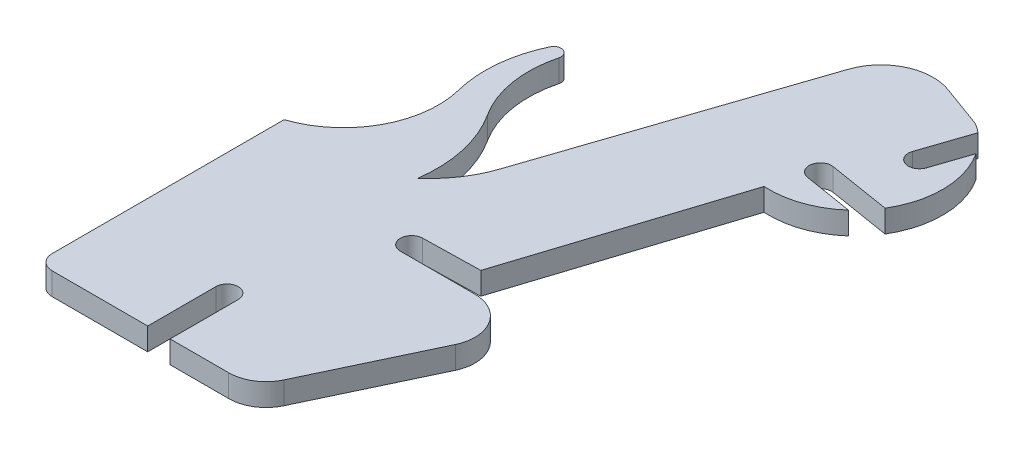
ISO-10303-21;
HEADER;
FILE_DESCRIPTION(('STEP AP214'),'2;1');
FILE_NAME('part.step','',(''),(''),'','','');
FILE_SCHEMA(('AUTOMOTIVE_DESIGN { 1 0 10303 214 1 1 1 1 }'));
ENDSEC;
DATA;
#1=APPLICATION_CONTEXT('core data for automotive mechanical design processes');
#2=APPLICATION_PROTOCOL_DEFINITION('international standard','automotive_design',2000,#1);
#3=PRODUCT_CONTEXT('',#1,'mechanical');
#4=PRODUCT('Part','Part','',(#3));
#5=PRODUCT_RELATED_PRODUCT_CATEGORY('part','',(#4));
#6=PRODUCT_DEFINITION_FORMATION('','',#4);
#7=PRODUCT_DEFINITION_CONTEXT('part definition',#1,'design');
#8=PRODUCT_DEFINITION('design','',#6,#7);
#9=PRODUCT_DEFINITION_SHAPE('','',#8);
#10=(LENGTH_UNIT() NAMED_UNIT(*) SI_UNIT(.MILLI.,.METRE.));
#11=(NAMED_UNIT(*) PLANE_ANGLE_UNIT() SI_UNIT($,.RADIAN.));
#12=(NAMED_UNIT(*) SI_UNIT($,.STERADIAN.) SOLID_ANGLE_UNIT());
#13=UNCERTAINTY_MEASURE_WITH_UNIT(LENGTH_MEASURE(1.E-05),#10,'distance_accuracy_value','');
#14=(GEOMETRIC_REPRESENTATION_CONTEXT(3) GLOBAL_UNCERTAINTY_ASSIGNED_CONTEXT((#13)) GLOBAL_UNIT_ASSIGNED_CONTEXT((#10,
#11,#12)) REPRESENTATION_CONTEXT('',''));
#15=CARTESIAN_POINT('',(0.,0.,0.));
#16=DIRECTION('',(0.,0.,1.));
#17=DIRECTION('',(1.,0.,0.));
#18=AXIS2_PLACEMENT_3D('',#15,#16,#17);
#19=CARTESIAN_POINT('',(0.,1.5,0.));
#20=DIRECTION('',(0.,0.,-1.));
#21=DIRECTION('',(-1.,0.,0.));
#22=AXIS2_PLACEMENT_3D('',#19,#20,#21);
#23=PLANE('',#22);
#24=DIRECTION('',(1.,0.,0.));
#25=VECTOR('',#24,1.);
#26=CARTESIAN_POINT('',(0.,1.5,0.));
#27=LINE('',#26,#25);
#28=CARTESIAN_POINT('',(2.,1.5,0.));
#29=VERTEX_POINT('',#28);
#30=CARTESIAN_POINT('',(14.8,1.5,0.));
#31=VERTEX_POINT('',#30);
#32=EDGE_CURVE('E241',#29,#31,#27,.T.);
#33=ORIENTED_EDGE('',*,*,#32,.F.);
#34=DIRECTION('',(0.,-1.,0.));
#35=VECTOR('',#34,1.);
#36=CARTESIAN_POINT('',(2.,1.5,0.));
#37=LINE('',#36,#35);
#38=CARTESIAN_POINT('',(2.,-1.5,0.));
#39=VERTEX_POINT('',#38);
#40=EDGE_CURVE('E292',#29,#39,#37,.T.);
#41=ORIENTED_EDGE('',*,*,#40,.T.);
#42=DIRECTION('',(1.,0.,0.));
#43=VECTOR('',#42,1.);
#44=CARTESIAN_POINT('',(0.,-1.5,0.));
#45=LINE('',#44,#43);
#46=CARTESIAN_POINT('',(14.8,-1.5,0.));
#47=VERTEX_POINT('',#46);
#48=EDGE_CURVE('E265',#39,#47,#45,.T.);
#49=ORIENTED_EDGE('',*,*,#48,.T.);
#50=DIRECTION('',(0.,-1.,0.));
#51=VECTOR('',#50,1.);
#52=CARTESIAN_POINT('',(14.8,1.5,0.));
#53=LINE('',#52,#51);
#54=EDGE_CURVE('E258',#31,#47,#53,.T.);
#55=ORIENTED_EDGE('',*,*,#54,.F.);
#56=EDGE_LOOP('',(#33,#41,#49,#55));
#57=FACE_BOUND('',#56,.T.);
#58=ADVANCED_FACE('F33',(#57),#23,.F.);
#59=CARTESIAN_POINT('',(14.8,1.5,0.));
#60=DIRECTION('',(-1.,0.,0.));
#61=DIRECTION('',(0.,0.,1.));
#62=AXIS2_PLACEMENT_3D('',#59,#60,#61);
#63=PLANE('',#62);
#64=DIRECTION('',(0.,0.,-1.));
#65=VECTOR('',#64,1.);
#66=CARTESIAN_POINT('',(14.8,-1.5,0.));
#67=LINE('',#66,#65);
#68=CARTESIAN_POINT('',(14.8,-1.5,-9.13));
#69=VERTEX_POINT('',#68);
#70=EDGE_CURVE('E438',#47,#69,#67,.T.);
#71=ORIENTED_EDGE('',*,*,#70,.T.);
#72=DIRECTION('',(0.,-1.,0.));
#73=VECTOR('',#72,1.);
#74=CARTESIAN_POINT('',(14.8,1.5,-9.13));
#75=LINE('',#74,#73);
#76=CARTESIAN_POINT('',(14.8,1.5,-9.13));
#77=VERTEX_POINT('',#76);
#78=EDGE_CURVE('E260',#77,#69,#75,.T.);
#79=ORIENTED_EDGE('',*,*,#78,.F.);
#80=DIRECTION('',(0.,0.,-1.));
#81=VECTOR('',#80,1.);
#82=CARTESIAN_POINT('',(14.8,1.5,0.));
#83=LINE('',#82,#81);
#84=EDGE_CURVE('E244',#31,#77,#83,.T.);
#85=ORIENTED_EDGE('',*,*,#84,.F.);
#86=ORIENTED_EDGE('',*,*,#54,.T.);
#87=EDGE_LOOP('',(#71,#79,#85,#86));
#88=FACE_BOUND('',#87,.T.);
#89=ADVANCED_FACE('F257',(#88),#63,.F.);
#90=CARTESIAN_POINT('',(16.3,1.5,-9.13));
#91=DIRECTION('',(0.,-1.,0.));
#92=DIRECTION('',(0.,0.,-1.));
#93=AXIS2_PLACEMENT_3D('',#90,#91,#92);
#94=CYLINDRICAL_SURFACE('',#93,1.5);
#95=CARTESIAN_POINT('',(16.3,-1.5,-9.13));
#96=DIRECTION('',(0.,-1.,0.));
#97=DIRECTION('',(0.,0.,-1.));
#98=AXIS2_PLACEMENT_3D('',#95,#96,#97);
#99=CIRCLE('',#98,1.5);
#100=CARTESIAN_POINT('',(17.8,-1.5,-9.13));
#101=VERTEX_POINT('',#100);
#102=EDGE_CURVE('E437',#69,#101,#99,.T.);
#103=ORIENTED_EDGE('',*,*,#102,.T.);
#104=DIRECTION('',(0.,-1.,0.));
#105=VECTOR('',#104,1.);
#106=CARTESIAN_POINT('',(17.8,1.5,-9.13));
#107=LINE('',#106,#105);
#108=CARTESIAN_POINT('',(17.8,1.5,-9.13));
#109=VERTEX_POINT('',#108);
#110=EDGE_CURVE('E272',#109,#101,#107,.T.);
#111=ORIENTED_EDGE('',*,*,#110,.F.);
#112=CARTESIAN_POINT('',(16.3,1.5,-9.13));
#113=DIRECTION('',(0.,-1.,0.));
#114=DIRECTION('',(0.,0.,-1.));
#115=AXIS2_PLACEMENT_3D('',#112,#113,#114);
#116=CIRCLE('',#115,1.5);
#117=EDGE_CURVE('E262',#77,#109,#116,.T.);
#118=ORIENTED_EDGE('',*,*,#117,.F.);
#119=ORIENTED_EDGE('',*,*,#78,.T.);
#120=EDGE_LOOP('',(#103,#111,#118,#119));
#121=FACE_BOUND('',#120,.T.);
#122=ADVANCED_FACE('F491',(#121),#94,.F.);
#123=CARTESIAN_POINT('',(17.8,1.5,-9.13));
#124=DIRECTION('',(1.,0.,0.));
#125=DIRECTION('',(0.,0.,-1.));
#126=AXIS2_PLACEMENT_3D('',#123,#124,#125);
#127=PLANE('',#126);
#128=DIRECTION('',(0.,0.,1.));
#129=VECTOR('',#128,1.);
#130=CARTESIAN_POINT('',(17.8,-1.5,-9.13));
#131=LINE('',#130,#129);
#132=CARTESIAN_POINT('',(17.8,-1.5,0.));
#133=VERTEX_POINT('',#132);
#134=EDGE_CURVE('E318',#101,#133,#131,.T.);
#135=ORIENTED_EDGE('',*,*,#134,.T.);
#136=DIRECTION('',(0.,-1.,0.));
#137=VECTOR('',#136,1.);
#138=CARTESIAN_POINT('',(17.8,1.5,0.));
#139=LINE('',#138,#137);
#140=CARTESIAN_POINT('',(17.8,1.5,0.));
#141=VERTEX_POINT('',#140);
#142=EDGE_CURVE('E425',#141,#133,#139,.T.);
#143=ORIENTED_EDGE('',*,*,#142,.F.);
#144=DIRECTION('',(0.,0.,1.));
#145=VECTOR('',#144,1.);
#146=CARTESIAN_POINT('',(17.8,1.5,-9.13));
#147=LINE('',#146,#145);
#148=EDGE_CURVE('E434',#109,#141,#147,.T.);
#149=ORIENTED_EDGE('',*,*,#148,.F.);
#150=ORIENTED_EDGE('',*,*,#110,.T.);
#151=EDGE_LOOP('',(#135,#143,#149,#150));
#152=FACE_BOUND('',#151,.T.);
#153=ADVANCED_FACE('F432',(#152),#127,.F.);
#154=CARTESIAN_POINT('',(17.8,1.5,0.));
#155=DIRECTION('',(0.,0.,-1.));
#156=DIRECTION('',(-1.,0.,0.));
#157=AXIS2_PLACEMENT_3D('',#154,#155,#156);
#158=PLANE('',#157);
#159=DIRECTION('',(1.,0.,0.));
#160=VECTOR('',#159,1.);
#161=CARTESIAN_POINT('',(17.8,-1.5,0.));
#162=LINE('',#161,#160);
#163=CARTESIAN_POINT('',(25.6540198927473,-1.5,0.));
#164=VERTEX_POINT('',#163);
#165=EDGE_CURVE('E314',#133,#164,#162,.T.);
#166=ORIENTED_EDGE('',*,*,#165,.T.);
#167=DIRECTION('',(0.,-1.,0.));
#168=VECTOR('',#167,1.);
#169=CARTESIAN_POINT('',(25.6540198927473,1.5,0.));
#170=LINE('',#169,#168);
#171=CARTESIAN_POINT('',(25.6540198927473,1.5,0.));
#172=VERTEX_POINT('',#171);
#173=EDGE_CURVE('E41',#164,#172,#170,.F.);
#174=ORIENTED_EDGE('',*,*,#173,.T.);
#175=DIRECTION('',(1.,0.,0.));
#176=VECTOR('',#175,1.);
#177=CARTESIAN_POINT('',(17.8,1.5,0.));
#178=LINE('',#177,#176);
#179=EDGE_CURVE('E488',#141,#172,#178,.T.);
#180=ORIENTED_EDGE('',*,*,#179,.F.);
#181=ORIENTED_EDGE('',*,*,#142,.T.);
#182=EDGE_LOOP('',(#166,#174,#180,#181));
#183=FACE_BOUND('',#182,.T.);
#184=ADVANCED_FACE('F498',(#183),#158,.F.);
#185=CARTESIAN_POINT('',(28.82,1.5,0.));
#186=DIRECTION('',(-0.903960606850971,0.,-0.427615740193956));
#187=DIRECTION('',(-0.427615740193956,0.,0.903960606850971));
#188=AXIS2_PLACEMENT_3D('',#185,#186,#187);
#189=PLANE('',#188);
#190=DIRECTION('',(0.427615740193956,0.,-0.903960606850971));
#191=VECTOR('',#190,1.);
#192=CARTESIAN_POINT('',(28.82,1.5,0.));
#193=LINE('',#192,#191);
#194=CARTESIAN_POINT('',(30.1738229270022,1.5,-2.86192129903022));
#195=VERTEX_POINT('',#194);
#196=CARTESIAN_POINT('',(37.5533541770022,1.5,-18.4619212990302));
#197=VERTEX_POINT('',#196);
#198=EDGE_CURVE('E307',#195,#197,#193,.T.);
#199=ORIENTED_EDGE('',*,*,#198,.F.);
#200=DIRECTION('',(0.,-1.,0.));
#201=VECTOR('',#200,1.);
#202=CARTESIAN_POINT('',(30.1738229270022,1.5,-2.86192129903022));
#203=LINE('',#202,#201);
#204=CARTESIAN_POINT('',(30.1738229270022,-1.5,-2.86192129903022));
#205=VERTEX_POINT('',#204);
#206=EDGE_CURVE('E299',#195,#205,#203,.T.);
#207=ORIENTED_EDGE('',*,*,#206,.T.);
#208=DIRECTION('',(0.427615740193956,0.,-0.903960606850971));
#209=VECTOR('',#208,1.);
#210=CARTESIAN_POINT('',(28.82,-1.5,0.));
#211=LINE('',#210,#209);
#212=CARTESIAN_POINT('',(37.5533541770022,-1.5,-18.4619212990302));
#213=VERTEX_POINT('',#212);
#214=EDGE_CURVE('E306',#205,#213,#211,.T.);
#215=ORIENTED_EDGE('',*,*,#214,.T.);
#216=DIRECTION('',(0.,-1.,0.));
#217=VECTOR('',#216,1.);
#218=CARTESIAN_POINT('',(37.5533541770022,1.5,-18.4619212990302));
#219=LINE('',#218,#217);
#220=EDGE_CURVE('E278',#213,#197,#219,.F.);
#221=ORIENTED_EDGE('',*,*,#220,.T.);
#222=EDGE_LOOP('',(#199,#207,#215,#221));
#223=FACE_BOUND('',#222,.T.);
#224=ADVANCED_FACE('F305',(#223),#189,.F.);
#225=CARTESIAN_POINT('',(40.93,1.5,-25.6));
#226=DIRECTION('',(0.,0.,1.));
#227=DIRECTION('',(1.,0.,0.));
#228=AXIS2_PLACEMENT_3D('',#225,#226,#227);
#229=PLANE('',#228);
#230=DIRECTION('',(-1.,0.,0.));
#231=VECTOR('',#230,1.);
#232=CARTESIAN_POINT('',(40.93,1.5,-25.6));
#233=LINE('',#232,#231);
#234=CARTESIAN_POINT('',(33.0335511427473,1.5,-25.6));
#235=VERTEX_POINT('',#234);
#236=CARTESIAN_POINT('',(23.0399152688008,1.5,-25.6));
#237=VERTEX_POINT('',#236);
#238=EDGE_CURVE('E485',#235,#237,#233,.T.);
#239=ORIENTED_EDGE('',*,*,#238,.F.);
#240=DIRECTION('',(0.,-1.,0.));
#241=VECTOR('',#240,1.);
#242=CARTESIAN_POINT('',(33.0335511427473,1.5,-25.6));
#243=LINE('',#242,#241);
#244=CARTESIAN_POINT('',(33.0335511427473,-1.5,-25.6));
#245=VERTEX_POINT('',#244);
#246=EDGE_CURVE('E267',#235,#245,#243,.T.);
#247=ORIENTED_EDGE('',*,*,#246,.T.);
#248=DIRECTION('',(-1.,0.,0.));
#249=VECTOR('',#248,1.);
#250=CARTESIAN_POINT('',(40.93,-1.5,-25.6));
#251=LINE('',#250,#249);
#252=CARTESIAN_POINT('',(23.0399152688008,-1.5,-25.6));
#253=VERTEX_POINT('',#252);
#254=EDGE_CURVE('E313',#245,#253,#251,.T.);
#255=ORIENTED_EDGE('',*,*,#254,.T.);
#256=DIRECTION('',(0.,-1.,0.));
#257=VECTOR('',#256,1.);
#258=CARTESIAN_POINT('',(23.0399152688008,1.5,-25.6));
#259=LINE('',#258,#257);
#260=EDGE_CURVE('E422',#237,#253,#259,.T.);
#261=ORIENTED_EDGE('',*,*,#260,.F.);
#262=EDGE_LOOP('',(#239,#247,#255,#261));
#263=FACE_BOUND('',#262,.T.);
#264=ADVANCED_FACE('F629',(#263),#229,.F.);
#265=CARTESIAN_POINT('',(23.0399152688008,1.5,-27.1));
#266=DIRECTION('',(0.,-1.,0.));
#267=DIRECTION('',(0.,0.,-1.));
#268=AXIS2_PLACEMENT_3D('',#265,#266,#267);
#269=CYLINDRICAL_SURFACE('',#268,1.5);
#270=CARTESIAN_POINT('',(23.0399152688008,-1.5,-27.1));
#271=DIRECTION('',(0.,-1.,0.));
#272=DIRECTION('',(0.,0.,-1.));
#273=AXIS2_PLACEMENT_3D('',#270,#271,#272);
#274=CIRCLE('',#273,1.5);
#275=CARTESIAN_POINT('',(23.0080306203165,-1.5,-28.5996610847758));
#276=VERTEX_POINT('',#275);
#277=EDGE_CURVE('E316',#253,#276,#274,.T.);
#278=ORIENTED_EDGE('',*,*,#277,.T.);
#279=DIRECTION('',(0.,-1.,0.));
#280=VECTOR('',#279,1.);
#281=CARTESIAN_POINT('',(23.0080306203165,1.5,-28.5996610847758));
#282=LINE('',#281,#280);
#283=CARTESIAN_POINT('',(23.0080306203165,1.5,-28.5996610847758));
#284=VERTEX_POINT('',#283);
#285=EDGE_CURVE('E419',#284,#276,#282,.T.);
#286=ORIENTED_EDGE('',*,*,#285,.F.);
#287=CARTESIAN_POINT('',(23.0399152688008,1.5,-27.1));
#288=DIRECTION('',(0.,-1.,0.));
#289=DIRECTION('',(0.,0.,-1.));
#290=AXIS2_PLACEMENT_3D('',#287,#288,#289);
#291=CIRCLE('',#290,1.5);
#292=EDGE_CURVE('E483',#237,#284,#291,.T.);
#293=ORIENTED_EDGE('',*,*,#292,.F.);
#294=ORIENTED_EDGE('',*,*,#260,.T.);
#295=EDGE_LOOP('',(#278,#286,#293,#294));
#296=FACE_BOUND('',#295,.T.);
#297=ADVANCED_FACE('F625',(#296),#269,.F.);
#298=CARTESIAN_POINT('',(23.0080306203165,1.5,-28.5996610847758));
#299=DIRECTION('',(-0.0212564323228623,0.,-0.999774056517223));
#300=DIRECTION('',(-0.999774056517223,0.,0.0212564323228623));
#301=AXIS2_PLACEMENT_3D('',#298,#299,#300);
#302=PLANE('',#301);
#303=DIRECTION('',(0.999774056517223,0.,-0.0212564323228623));
#304=VECTOR('',#303,1.);
#305=CARTESIAN_POINT('',(23.0080306203165,-1.5,-28.5996610847758));
#306=LINE('',#305,#304);
#307=CARTESIAN_POINT('',(30.66,-1.5,-28.762351412851));
#308=VERTEX_POINT('',#307);
#309=EDGE_CURVE('E323',#276,#308,#306,.T.);
#310=ORIENTED_EDGE('',*,*,#309,.T.);
#311=DIRECTION('',(0.,-1.,0.));
#312=VECTOR('',#311,1.);
#313=CARTESIAN_POINT('',(30.66,1.5,-28.762351412851));
#314=LINE('',#313,#312);
#315=CARTESIAN_POINT('',(30.66,1.5,-28.762351412851));
#316=VERTEX_POINT('',#315);
#317=EDGE_CURVE('E416',#316,#308,#314,.T.);
#318=ORIENTED_EDGE('',*,*,#317,.F.);
#319=DIRECTION('',(0.999774056517223,0.,-0.0212564323228623));
#320=VECTOR('',#319,1.);
#321=CARTESIAN_POINT('',(23.0080306203165,1.5,-28.5996610847758));
#322=LINE('',#321,#320);
#323=EDGE_CURVE('E481',#284,#316,#322,.T.);
#324=ORIENTED_EDGE('',*,*,#323,.F.);
#325=ORIENTED_EDGE('',*,*,#285,.T.);
#326=EDGE_LOOP('',(#310,#318,#324,#325));
#327=FACE_BOUND('',#326,.T.);
#328=ADVANCED_FACE('F620',(#327),#302,.F.);
#329=CARTESIAN_POINT('',(30.66,1.5,-28.762351412851));
#330=DIRECTION('',(-0.95194927980792,0.,-0.306255724310881));
#331=DIRECTION('',(-0.306255724310881,0.,0.95194927980792));
#332=AXIS2_PLACEMENT_3D('',#329,#330,#331);
#333=PLANE('',#332);
#334=DIRECTION('',(0.306255724310881,0.,-0.95194927980792));
#335=VECTOR('',#334,1.);
#336=CARTESIAN_POINT('',(30.66,-1.5,-28.762351412851));
#337=LINE('',#336,#335);
#338=CARTESIAN_POINT('',(39.8931210885189,-1.5,-57.4621022187257));
#339=VERTEX_POINT('',#338);
#340=EDGE_CURVE('E325',#308,#339,#337,.T.);
#341=ORIENTED_EDGE('',*,*,#340,.T.);
#342=DIRECTION('',(0.,-1.,0.));
#343=VECTOR('',#342,1.);
#344=CARTESIAN_POINT('',(39.8931210885189,1.5,-57.4621022187257));
#345=LINE('',#344,#343);
#346=CARTESIAN_POINT('',(39.8931210885189,1.5,-57.4621022187257));
#347=VERTEX_POINT('',#346);
#348=EDGE_CURVE('E413',#347,#339,#345,.T.);
#349=ORIENTED_EDGE('',*,*,#348,.F.);
#350=DIRECTION('',(0.306255724310881,0.,-0.95194927980792));
#351=VECTOR('',#350,1.);
#352=CARTESIAN_POINT('',(30.66,1.5,-28.762351412851));
#353=LINE('',#352,#351);
#354=EDGE_CURVE('E479',#316,#347,#353,.T.);
#355=ORIENTED_EDGE('',*,*,#354,.F.);
#356=ORIENTED_EDGE('',*,*,#317,.T.);
#357=EDGE_LOOP('',(#341,#349,#355,#356));
#358=FACE_BOUND('',#357,.T.);
#359=ADVANCED_FACE('F615',(#358),#333,.F.);
#360=CARTESIAN_POINT('',(40.5731273575201,1.5,-69.071695735915));
#361=DIRECTION('',(0.,-1.,0.));
#362=DIRECTION('',(0.,0.,-1.));
#363=AXIS2_PLACEMENT_3D('',#360,#361,#362);
#364=CYLINDRICAL_SURFACE('',#363,11.6294913973159);
#365=CARTESIAN_POINT('',(40.5731273575201,-1.5,-69.071695735915));
#366=DIRECTION('',(0.,1.,0.));
#367=DIRECTION('',(0.,0.,1.));
#368=AXIS2_PLACEMENT_3D('',#365,#366,#367);
#369=CIRCLE('',#368,11.6294913973159);
#370=CARTESIAN_POINT('',(48.2921086879226,-1.5,-60.3732822379751));
#371=VERTEX_POINT('',#370);
#372=EDGE_CURVE('E327',#339,#371,#369,.T.);
#373=ORIENTED_EDGE('',*,*,#372,.T.);
#374=DIRECTION('',(0.,-1.,0.));
#375=VECTOR('',#374,1.);
#376=CARTESIAN_POINT('',(48.2921086879226,1.5,-60.3732822379751));
#377=LINE('',#376,#375);
#378=CARTESIAN_POINT('',(48.2921086879226,1.5,-60.3732822379751));
#379=VERTEX_POINT('',#378);
#380=EDGE_CURVE('E410',#379,#371,#377,.T.);
#381=ORIENTED_EDGE('',*,*,#380,.F.);
#382=CARTESIAN_POINT('',(40.5731273575201,1.5,-69.071695735915));
#383=DIRECTION('',(0.,1.,0.));
#384=DIRECTION('',(0.,0.,1.));
#385=AXIS2_PLACEMENT_3D('',#382,#383,#384);
#386=CIRCLE('',#385,11.6294913973159);
#387=EDGE_CURVE('E477',#347,#379,#386,.T.);
#388=ORIENTED_EDGE('',*,*,#387,.F.);
#389=ORIENTED_EDGE('',*,*,#348,.T.);
#390=EDGE_LOOP('',(#373,#381,#388,#389));
#391=FACE_BOUND('',#390,.T.);
#392=ADVANCED_FACE('F611',(#391),#364,.T.);
#393=CARTESIAN_POINT('',(41.74,1.5,-61.4389067042235));
#394=DIRECTION('',(-0.160529157513303,0.,0.987031098592172));
#395=DIRECTION('',(0.987031098592172,0.,0.160529157513303));
#396=AXIS2_PLACEMENT_3D('',#393,#394,#395);
#397=PLANE('',#396);
#398=DIRECTION('',(-0.987031098592172,0.,-0.160529157513303));
#399=VECTOR('',#398,1.);
#400=CARTESIAN_POINT('',(41.74,-1.5,-61.4389067042235));
#401=LINE('',#400,#399);
#402=CARTESIAN_POINT('',(41.74,-1.5,-61.4389067042235));
#403=VERTEX_POINT('',#402);
#404=EDGE_CURVE('E329',#371,#403,#401,.T.);
#405=ORIENTED_EDGE('',*,*,#404,.T.);
#406=DIRECTION('',(0.,-1.,0.));
#407=VECTOR('',#406,1.);
#408=CARTESIAN_POINT('',(41.74,1.5,-61.4389067042235));
#409=LINE('',#408,#407);
#410=CARTESIAN_POINT('',(41.74,1.5,-61.4389067042235));
#411=VERTEX_POINT('',#410);
#412=EDGE_CURVE('E407',#411,#403,#409,.T.);
#413=ORIENTED_EDGE('',*,*,#412,.F.);
#414=DIRECTION('',(-0.987031098592172,0.,-0.160529157513303));
#415=VECTOR('',#414,1.);
#416=CARTESIAN_POINT('',(41.74,1.5,-61.4389067042235));
#417=LINE('',#416,#415);
#418=EDGE_CURVE('E475',#379,#411,#417,.T.);
#419=ORIENTED_EDGE('',*,*,#418,.F.);
#420=ORIENTED_EDGE('',*,*,#380,.T.);
#421=EDGE_LOOP('',(#405,#413,#419,#420));
#422=FACE_BOUND('',#421,.T.);
#423=ADVANCED_FACE('F606',(#422),#397,.F.);
#424=CARTESIAN_POINT('',(41.98079373627,1.5,-62.9194533521118));
#425=DIRECTION('',(0.,-1.,0.));
#426=DIRECTION('',(0.,0.,-1.));
#427=AXIS2_PLACEMENT_3D('',#424,#425,#426);
#428=CYLINDRICAL_SURFACE('',#427,1.5);
#429=CARTESIAN_POINT('',(41.98079373627,-1.5,-62.9194533521118));
#430=DIRECTION('',(0.,-1.,0.));
#431=DIRECTION('',(0.,0.,1.));
#432=AXIS2_PLACEMENT_3D('',#429,#430,#431);
#433=CIRCLE('',#432,1.5);
#434=CARTESIAN_POINT('',(42.2215874725399,-1.5,-64.4));
#435=VERTEX_POINT('',#434);
#436=EDGE_CURVE('E331',#403,#435,#433,.T.);
#437=ORIENTED_EDGE('',*,*,#436,.T.);
#438=DIRECTION('',(0.,-1.,0.));
#439=VECTOR('',#438,1.);
#440=CARTESIAN_POINT('',(42.2215874725399,1.5,-64.4));
#441=LINE('',#440,#439);
#442=CARTESIAN_POINT('',(42.2215874725399,1.5,-64.4));
#443=VERTEX_POINT('',#442);
#444=EDGE_CURVE('E404',#443,#435,#441,.T.);
#445=ORIENTED_EDGE('',*,*,#444,.F.);
#446=CARTESIAN_POINT('',(41.98079373627,1.5,-62.9194533521118));
#447=DIRECTION('',(0.,-1.,0.));
#448=DIRECTION('',(0.,0.,1.));
#449=AXIS2_PLACEMENT_3D('',#446,#447,#448);
#450=CIRCLE('',#449,1.5);
#451=EDGE_CURVE('E473',#411,#443,#450,.T.);
#452=ORIENTED_EDGE('',*,*,#451,.F.);
#453=ORIENTED_EDGE('',*,*,#412,.T.);
#454=EDGE_LOOP('',(#437,#445,#452,#453));
#455=FACE_BOUND('',#454,.T.);
#456=ADVANCED_FACE('F600',(#455),#428,.F.);
#457=CARTESIAN_POINT('',(50.5222102612008,1.5,-63.05));
#458=DIRECTION('',(0.160529157513301,0.,-0.987031098592172));
#459=DIRECTION('',(-0.987031098592172,0.,-0.160529157513301));
#460=AXIS2_PLACEMENT_3D('',#457,#458,#459);
#461=PLANE('',#460);
#462=DIRECTION('',(0.987031098592172,0.,0.160529157513301));
#463=VECTOR('',#462,1.);
#464=CARTESIAN_POINT('',(50.5222102612008,-1.5,-63.05));
#465=LINE('',#464,#463);
#466=CARTESIAN_POINT('',(50.5222102612008,-1.5,-63.05));
#467=VERTEX_POINT('',#466);
#468=EDGE_CURVE('E333',#435,#467,#465,.T.);
#469=ORIENTED_EDGE('',*,*,#468,.T.);
#470=DIRECTION('',(0.,-1.,0.));
#471=VECTOR('',#470,1.);
#472=CARTESIAN_POINT('',(50.5222102612008,1.5,-63.05));
#473=LINE('',#472,#471);
#474=CARTESIAN_POINT('',(50.5222102612008,1.5,-63.05));
#475=VERTEX_POINT('',#474);
#476=EDGE_CURVE('E401',#475,#467,#473,.T.);
#477=ORIENTED_EDGE('',*,*,#476,.F.);
#478=DIRECTION('',(0.987031098592172,0.,0.160529157513301));
#479=VECTOR('',#478,1.);
#480=CARTESIAN_POINT('',(50.5222102612008,1.5,-63.05));
#481=LINE('',#480,#479);
#482=EDGE_CURVE('E471',#443,#475,#481,.T.);
#483=ORIENTED_EDGE('',*,*,#482,.F.);
#484=ORIENTED_EDGE('',*,*,#444,.T.);
#485=EDGE_LOOP('',(#469,#477,#483,#484));
#486=FACE_BOUND('',#485,.T.);
#487=ADVANCED_FACE('F596',(#486),#461,.F.);
#488=CARTESIAN_POINT('',(40.5731273575201,1.5,-69.071695735915));
#489=DIRECTION('',(0.,-1.,0.));
#490=DIRECTION('',(0.,0.,-1.));
#491=AXIS2_PLACEMENT_3D('',#488,#489,#490);
#492=CYLINDRICAL_SURFACE('',#491,11.629491397316);
#493=CARTESIAN_POINT('',(40.5731273575201,-1.5,-69.071695735915));
#494=DIRECTION('',(0.,1.,0.));
#495=DIRECTION('',(0.,0.,1.));
#496=AXIS2_PLACEMENT_3D('',#493,#494,#495);
#497=CIRCLE('',#496,11.629491397316);
#498=CARTESIAN_POINT('',(50.2879647462515,-1.5,-75.4644263473794));
#499=VERTEX_POINT('',#498);
#500=EDGE_CURVE('E335',#467,#499,#497,.T.);
#501=ORIENTED_EDGE('',*,*,#500,.T.);
#502=DIRECTION('',(0.,-1.,0.));
#503=VECTOR('',#502,1.);
#504=CARTESIAN_POINT('',(50.2879647462515,1.5,-75.4644263473794));
#505=LINE('',#504,#503);
#506=CARTESIAN_POINT('',(50.2879647462515,1.5,-75.4644263473794));
#507=VERTEX_POINT('',#506);
#508=EDGE_CURVE('E398',#507,#499,#505,.T.);
#509=ORIENTED_EDGE('',*,*,#508,.F.);
#510=CARTESIAN_POINT('',(40.5731273575201,1.5,-69.071695735915));
#511=DIRECTION('',(0.,1.,0.));
#512=DIRECTION('',(0.,0.,1.));
#513=AXIS2_PLACEMENT_3D('',#510,#511,#512);
#514=CIRCLE('',#513,11.629491397316);
#515=EDGE_CURVE('E469',#475,#507,#514,.T.);
#516=ORIENTED_EDGE('',*,*,#515,.F.);
#517=ORIENTED_EDGE('',*,*,#476,.T.);
#518=EDGE_LOOP('',(#501,#509,#516,#517));
#519=FACE_BOUND('',#518,.T.);
#520=ADVANCED_FACE('F591',(#519),#492,.T.);
#521=CARTESIAN_POINT('',(48.6195562243427,1.5,-70.5090262232915));
#522=DIRECTION('',(0.947726073371169,0.,0.319085082466206));
#523=DIRECTION('',(0.319085082466206,0.,-0.947726073371169));
#524=AXIS2_PLACEMENT_3D('',#521,#522,#523);
#525=PLANE('',#524);
#526=DIRECTION('',(-0.319085082466206,0.,0.947726073371169));
#527=VECTOR('',#526,1.);
#528=CARTESIAN_POINT('',(48.6195562243427,-1.5,-70.5090262232915));
#529=LINE('',#528,#527);
#530=CARTESIAN_POINT('',(48.6195562243428,-1.5,-70.5090262232914));
#531=VERTEX_POINT('',#530);
#532=EDGE_CURVE('E337',#499,#531,#529,.T.);
#533=ORIENTED_EDGE('',*,*,#532,.T.);
#534=DIRECTION('',(0.,-1.,0.));
#535=VECTOR('',#534,1.);
#536=CARTESIAN_POINT('',(48.6195562243428,1.5,-70.5090262232914));
#537=LINE('',#536,#535);
#538=CARTESIAN_POINT('',(48.6195562243428,1.5,-70.5090262232914));
#539=VERTEX_POINT('',#538);
#540=EDGE_CURVE('E395',#539,#531,#537,.T.);
#541=ORIENTED_EDGE('',*,*,#540,.F.);
#542=DIRECTION('',(-0.319085082466206,0.,0.947726073371169));
#543=VECTOR('',#542,1.);
#544=CARTESIAN_POINT('',(48.6195562243427,1.5,-70.5090262232915));
#545=LINE('',#544,#543);
#546=EDGE_CURVE('E467',#507,#539,#545,.T.);
#547=ORIENTED_EDGE('',*,*,#546,.F.);
#548=ORIENTED_EDGE('',*,*,#508,.T.);
#549=EDGE_LOOP('',(#533,#541,#547,#548));
#550=FACE_BOUND('',#549,.T.);
#551=ADVANCED_FACE('F585',(#550),#525,.F.);
#552=CARTESIAN_POINT('',(47.1979671142862,1.5,-70.9876538469907));
#553=DIRECTION('',(0.,-1.,0.));
#554=DIRECTION('',(0.,0.,-1.));
#555=AXIS2_PLACEMENT_3D('',#552,#553,#554);
#556=CYLINDRICAL_SURFACE('',#555,1.49999999999988);
#557=CARTESIAN_POINT('',(47.1979671142862,-1.5,-70.9876538469907));
#558=DIRECTION('',(0.,-1.,0.));
#559=DIRECTION('',(0.,0.,1.));
#560=AXIS2_PLACEMENT_3D('',#557,#558,#559);
#561=CIRCLE('',#560,1.49999999999988);
#562=CARTESIAN_POINT('',(45.7763780042294,-1.5,-71.4662814706899));
#563=VERTEX_POINT('',#562);
#564=EDGE_CURVE('E339',#531,#563,#561,.T.);
#565=ORIENTED_EDGE('',*,*,#564,.T.);
#566=DIRECTION('',(0.,-1.,0.));
#567=VECTOR('',#566,1.);
#568=CARTESIAN_POINT('',(45.7763780042294,1.5,-71.4662814706899));
#569=LINE('',#568,#567);
#570=CARTESIAN_POINT('',(45.7763780042294,1.5,-71.4662814706899));
#571=VERTEX_POINT('',#570);
#572=EDGE_CURVE('E392',#571,#563,#569,.T.);
#573=ORIENTED_EDGE('',*,*,#572,.F.);
#574=CARTESIAN_POINT('',(47.1979671142862,1.5,-70.9876538469907));
#575=DIRECTION('',(0.,-1.,0.));
#576=DIRECTION('',(0.,0.,1.));
#577=AXIS2_PLACEMENT_3D('',#574,#575,#576);
#578=CIRCLE('',#577,1.49999999999988);
#579=EDGE_CURVE('E465',#539,#571,#578,.T.);
#580=ORIENTED_EDGE('',*,*,#579,.F.);
#581=ORIENTED_EDGE('',*,*,#540,.T.);
#582=EDGE_LOOP('',(#565,#573,#580,#581));
#583=FACE_BOUND('',#582,.T.);
#584=ADVANCED_FACE('F581',(#583),#556,.F.);
#585=CARTESIAN_POINT('',(47.9868558861516,1.5,-78.0317012863598));
#586=DIRECTION('',(-0.947726073371185,0.,-0.319085082466159));
#587=DIRECTION('',(-0.319085082466159,0.,0.947726073371185));
#588=AXIS2_PLACEMENT_3D('',#585,#586,#587);
#589=PLANE('',#588);
#590=DIRECTION('',(0.319085082466159,0.,-0.947726073371185));
#591=VECTOR('',#590,1.);
#592=CARTESIAN_POINT('',(47.9868558861516,-1.5,-78.0317012863598));
#593=LINE('',#592,#591);
#594=CARTESIAN_POINT('',(47.9868558861516,-1.5,-78.0317012863598));
#595=VERTEX_POINT('',#594);
#596=EDGE_CURVE('E341',#563,#595,#593,.T.);
#597=ORIENTED_EDGE('',*,*,#596,.T.);
#598=DIRECTION('',(0.,-1.,0.));
#599=VECTOR('',#598,1.);
#600=CARTESIAN_POINT('',(47.9868558861516,1.5,-78.0317012863598));
#601=LINE('',#600,#599);
#602=CARTESIAN_POINT('',(47.9868558861516,1.5,-78.0317012863598));
#603=VERTEX_POINT('',#602);
#604=EDGE_CURVE('E389',#603,#595,#601,.T.);
#605=ORIENTED_EDGE('',*,*,#604,.F.);
#606=DIRECTION('',(0.319085082466159,0.,-0.947726073371185));
#607=VECTOR('',#606,1.);
#608=CARTESIAN_POINT('',(47.9868558861516,1.5,-78.0317012863598));
#609=LINE('',#608,#607);
#610=EDGE_CURVE('E463',#571,#603,#609,.T.);
#611=ORIENTED_EDGE('',*,*,#610,.F.);
#612=ORIENTED_EDGE('',*,*,#572,.T.);
#613=EDGE_LOOP('',(#597,#605,#611,#612));
#614=FACE_BOUND('',#613,.T.);
#615=ADVANCED_FACE('F577',(#614),#589,.F.);
#616=CARTESIAN_POINT('',(40.5731273575201,1.5,-69.071695735915));
#617=DIRECTION('',(0.,-1.,0.));
#618=DIRECTION('',(0.,0.,-1.));
#619=AXIS2_PLACEMENT_3D('',#616,#617,#618);
#620=CYLINDRICAL_SURFACE('',#619,11.629491397316);
#621=CARTESIAN_POINT('',(40.5731273575201,-1.5,-69.071695735915));
#622=DIRECTION('',(0.,1.,0.));
#623=DIRECTION('',(0.,0.,1.));
#624=AXIS2_PLACEMENT_3D('',#621,#622,#623);
#625=CIRCLE('',#624,11.629491397316);
#626=CARTESIAN_POINT('',(46.79,-1.5,-78.9));
#627=VERTEX_POINT('',#626);
#628=EDGE_CURVE('E343',#595,#627,#625,.T.);
#629=ORIENTED_EDGE('',*,*,#628,.T.);
#630=DIRECTION('',(0.,-1.,0.));
#631=VECTOR('',#630,1.);
#632=CARTESIAN_POINT('',(46.79,1.5,-78.9));
#633=LINE('',#632,#631);
#634=CARTESIAN_POINT('',(46.79,1.5,-78.9));
#635=VERTEX_POINT('',#634);
#636=EDGE_CURVE('E386',#635,#627,#633,.T.);
#637=ORIENTED_EDGE('',*,*,#636,.F.);
#638=CARTESIAN_POINT('',(40.5731273575201,1.5,-69.071695735915));
#639=DIRECTION('',(0.,1.,0.));
#640=DIRECTION('',(0.,0.,1.));
#641=AXIS2_PLACEMENT_3D('',#638,#639,#640);
#642=CIRCLE('',#641,11.629491397316);
#643=EDGE_CURVE('E461',#603,#635,#642,.T.);
#644=ORIENTED_EDGE('',*,*,#643,.F.);
#645=ORIENTED_EDGE('',*,*,#604,.T.);
#646=EDGE_LOOP('',(#629,#637,#644,#645));
#647=FACE_BOUND('',#646,.T.);
#648=ADVANCED_FACE('F572',(#647),#620,.T.);
#649=CARTESIAN_POINT('',(46.79,1.5,-78.9));
#650=DIRECTION('',(-0.34265342494036,0.,0.939461883408071));
#651=DIRECTION('',(0.939461883408072,0.,0.34265342494036));
#652=AXIS2_PLACEMENT_3D('',#649,#650,#651);
#653=PLANE('',#652);
#654=DIRECTION('',(-0.939461883408072,0.,-0.34265342494036));
#655=VECTOR('',#654,1.);
#656=CARTESIAN_POINT('',(46.79,-1.5,-78.9));
#657=LINE('',#656,#655);
#658=CARTESIAN_POINT('',(40.9625663933566,-1.5,-81.0254615213181));
#659=VERTEX_POINT('',#658);
#660=EDGE_CURVE('E345',#627,#659,#657,.T.);
#661=ORIENTED_EDGE('',*,*,#660,.T.);
#662=DIRECTION('',(0.,-1.,0.));
#663=VECTOR('',#662,1.);
#664=CARTESIAN_POINT('',(40.9625663933566,1.5,-81.0254615213181));
#665=LINE('',#664,#663);
#666=CARTESIAN_POINT('',(40.9625663933566,1.5,-81.0254615213181));
#667=VERTEX_POINT('',#666);
#668=EDGE_CURVE('E288',#659,#667,#665,.F.);
#669=ORIENTED_EDGE('',*,*,#668,.T.);
#670=DIRECTION('',(-0.939461883408072,0.,-0.34265342494036));
#671=VECTOR('',#670,1.);
#672=CARTESIAN_POINT('',(46.79,1.5,-78.9));
#673=LINE('',#672,#671);
#674=EDGE_CURVE('E458',#635,#667,#673,.T.);
#675=ORIENTED_EDGE('',*,*,#674,.F.);
#676=ORIENTED_EDGE('',*,*,#636,.T.);
#677=EDGE_LOOP('',(#661,#669,#675,#676));
#678=FACE_BOUND('',#677,.T.);
#679=ADVANCED_FACE('F564',(#678),#653,.F.);
#680=CARTESIAN_POINT('',(34.22,1.5,-83.484702825702));
#681=DIRECTION('',(0.947726073371185,0.,0.319085082466159));
#682=DIRECTION('',(0.319085082466159,0.,-0.947726073371185));
#683=AXIS2_PLACEMENT_3D('',#680,#681,#682);
#684=PLANE('',#683);
#685=DIRECTION('',(-0.319085082466159,0.,0.947726073371185));
#686=VECTOR('',#685,1.);
#687=CARTESIAN_POINT('',(34.22,1.5,-83.484702825702));
#688=LINE('',#687,#686);
#689=CARTESIAN_POINT('',(31.9299099051758,1.5,-76.6828239147248));
#690=VERTEX_POINT('',#689);
#691=CARTESIAN_POINT('',(20.1713543051432,1.5,-41.7583152501198));
#692=VERTEX_POINT('',#691);
#693=EDGE_CURVE('E456',#690,#692,#688,.T.);
#694=ORIENTED_EDGE('',*,*,#693,.F.);
#695=DIRECTION('',(0.,-1.,0.));
#696=VECTOR('',#695,1.);
#697=CARTESIAN_POINT('',(31.9299099051758,1.5,-76.6828239147248));
#698=LINE('',#697,#696);
#699=CARTESIAN_POINT('',(31.9299099051758,-1.5,-76.6828239147248));
#700=VERTEX_POINT('',#699);
#701=EDGE_CURVE('E283',#690,#700,#698,.T.);
#702=ORIENTED_EDGE('',*,*,#701,.T.);
#703=DIRECTION('',(-0.319085082466159,0.,0.947726073371185));
#704=VECTOR('',#703,1.);
#705=CARTESIAN_POINT('',(34.22,-1.5,-83.484702825702));
#706=LINE('',#705,#704);
#707=CARTESIAN_POINT('',(20.1713543051432,-1.5,-41.7583152501198));
#708=VERTEX_POINT('',#707);
#709=EDGE_CURVE('E348',#700,#708,#706,.T.);
#710=ORIENTED_EDGE('',*,*,#709,.T.);
#711=DIRECTION('',(0.,-1.,0.));
#712=VECTOR('',#711,1.);
#713=CARTESIAN_POINT('',(20.1713543051432,1.5,-41.7583152501198));
#714=LINE('',#713,#712);
#715=EDGE_CURVE('E383',#692,#708,#714,.T.);
#716=ORIENTED_EDGE('',*,*,#715,.F.);
#717=EDGE_LOOP('',(#694,#702,#710,#716));
#718=FACE_BOUND('',#717,.T.);
#719=ADVANCED_FACE('F558',(#718),#684,.F.);
#720=CARTESIAN_POINT('',(6.17869455637038,1.5,-46.46943285605));
#721=DIRECTION('',(0.,-1.,0.));
#722=DIRECTION('',(0.,0.,-1.));
#723=AXIS2_PLACEMENT_3D('',#720,#721,#722);
#724=CYLINDRICAL_SURFACE('',#723,14.7644558295196);
#725=CARTESIAN_POINT('',(6.17869455637038,-1.5,-46.46943285605));
#726=DIRECTION('',(0.,-1.,0.));
#727=DIRECTION('',(0.,0.,-1.));
#728=AXIS2_PLACEMENT_3D('',#725,#726,#727);
#729=CIRCLE('',#728,14.7644558295196);
#730=CARTESIAN_POINT('',(15.7532171283456,-1.5,-35.2303193029015));
#731=VERTEX_POINT('',#730);
#732=EDGE_CURVE('E350',#708,#731,#729,.T.);
#733=ORIENTED_EDGE('',*,*,#732,.T.);
#734=DIRECTION('',(0.,-1.,0.));
#735=VECTOR('',#734,1.);
#736=CARTESIAN_POINT('',(15.7532171283456,1.5,-35.2303193029015));
#737=LINE('',#736,#735);
#738=CARTESIAN_POINT('',(15.7532171283456,1.5,-35.2303193029015));
#739=VERTEX_POINT('',#738);
#740=EDGE_CURVE('E380',#739,#731,#737,.T.);
#741=ORIENTED_EDGE('',*,*,#740,.F.);
#742=CARTESIAN_POINT('',(6.17869455637038,1.5,-46.46943285605));
#743=DIRECTION('',(0.,-1.,0.));
#744=DIRECTION('',(0.,0.,-1.));
#745=AXIS2_PLACEMENT_3D('',#742,#743,#744);
#746=CIRCLE('',#745,14.7644558295196);
#747=EDGE_CURVE('E454',#692,#739,#746,.T.);
#748=ORIENTED_EDGE('',*,*,#747,.F.);
#749=ORIENTED_EDGE('',*,*,#715,.T.);
#750=EDGE_LOOP('',(#733,#741,#748,#749));
#751=FACE_BOUND('',#750,.T.);
#752=ADVANCED_FACE('F554',(#751),#724,.F.);
#753=CARTESIAN_POINT('',(-1.68153910041539,1.5,-37.6413424698073));
#754=DIRECTION('',(0.,-1.,0.));
#755=DIRECTION('',(0.,0.,-1.));
#756=AXIS2_PLACEMENT_3D('',#753,#754,#755);
#757=CYLINDRICAL_SURFACE('',#756,17.6006749151183);
#758=CARTESIAN_POINT('',(-1.68153910041539,-1.5,-37.6413424698073));
#759=DIRECTION('',(0.,1.,0.));
#760=DIRECTION('',(0.,0.,1.));
#761=AXIS2_PLACEMENT_3D('',#758,#759,#760);
#762=CIRCLE('',#761,17.6006749151183);
#763=CARTESIAN_POINT('',(13.0890455888799,-1.5,-47.2128410674162));
#764=VERTEX_POINT('',#763);
#765=EDGE_CURVE('E352',#731,#764,#762,.T.);
#766=ORIENTED_EDGE('',*,*,#765,.T.);
#767=DIRECTION('',(0.,-1.,0.));
#768=VECTOR('',#767,1.);
#769=CARTESIAN_POINT('',(13.0890455888799,1.5,-47.2128410674162));
#770=LINE('',#769,#768);
#771=CARTESIAN_POINT('',(13.0890455888799,1.5,-47.2128410674162));
#772=VERTEX_POINT('',#771);
#773=EDGE_CURVE('E377',#772,#764,#770,.T.);
#774=ORIENTED_EDGE('',*,*,#773,.F.);
#775=CARTESIAN_POINT('',(-1.68153910041539,1.5,-37.6413424698073));
#776=DIRECTION('',(0.,1.,0.));
#777=DIRECTION('',(0.,0.,1.));
#778=AXIS2_PLACEMENT_3D('',#775,#776,#777);
#779=CIRCLE('',#778,17.6006749151183);
#780=EDGE_CURVE('E452',#739,#772,#779,.T.);
#781=ORIENTED_EDGE('',*,*,#780,.F.);
#782=ORIENTED_EDGE('',*,*,#740,.T.);
#783=EDGE_LOOP('',(#766,#774,#781,#782));
#784=FACE_BOUND('',#783,.T.);
#785=ADVANCED_FACE('F549',(#784),#757,.T.);
#786=CARTESIAN_POINT('',(25.175637610257,1.5,-55.0450833933642));
#787=DIRECTION('',(0.,-1.,0.));
#788=DIRECTION('',(0.,0.,-1.));
#789=AXIS2_PLACEMENT_3D('',#786,#787,#788);
#790=CYLINDRICAL_SURFACE('',#789,14.40242085705);
#791=CARTESIAN_POINT('',(25.175637610257,-1.5,-55.0450833933642));
#792=DIRECTION('',(0.,-1.,0.));
#793=DIRECTION('',(0.,0.,-1.));
#794=AXIS2_PLACEMENT_3D('',#791,#792,#793);
#795=CIRCLE('',#794,14.40242085705);
#796=CARTESIAN_POINT('',(11.2329472678582,-1.5,-58.6549466261697));
#797=VERTEX_POINT('',#796);
#798=EDGE_CURVE('E354',#764,#797,#795,.T.);
#799=ORIENTED_EDGE('',*,*,#798,.T.);
#800=DIRECTION('',(0.,-1.,0.));
#801=VECTOR('',#800,1.);
#802=CARTESIAN_POINT('',(11.2329472678582,1.5,-58.6549466261697));
#803=LINE('',#802,#801);
#804=CARTESIAN_POINT('',(11.2329472678582,1.5,-58.6549466261697));
#805=VERTEX_POINT('',#804);
#806=EDGE_CURVE('E374',#805,#797,#803,.T.);
#807=ORIENTED_EDGE('',*,*,#806,.F.);
#808=CARTESIAN_POINT('',(25.175637610257,1.5,-55.0450833933642));
#809=DIRECTION('',(0.,-1.,0.));
#810=DIRECTION('',(0.,0.,-1.));
#811=AXIS2_PLACEMENT_3D('',#808,#809,#810);
#812=CIRCLE('',#811,14.40242085705);
#813=EDGE_CURVE('E450',#772,#805,#812,.T.);
#814=ORIENTED_EDGE('',*,*,#813,.F.);
#815=ORIENTED_EDGE('',*,*,#773,.T.);
#816=EDGE_LOOP('',(#799,#807,#814,#815));
#817=FACE_BOUND('',#816,.T.);
#818=ADVANCED_FACE('F543',(#817),#790,.F.);
#819=CARTESIAN_POINT('',(10.264867631748,1.5,-58.9055894360581));
#820=DIRECTION('',(0.,-1.,0.));
#821=DIRECTION('',(0.,0.,-1.));
#822=AXIS2_PLACEMENT_3D('',#819,#820,#821);
#823=CYLINDRICAL_SURFACE('',#822,1.);
#824=CARTESIAN_POINT('',(10.264867631748,-1.5,-58.9055894360581));
#825=DIRECTION('',(0.,1.,0.));
#826=DIRECTION('',(0.,0.,1.));
#827=AXIS2_PLACEMENT_3D('',#824,#825,#826);
#828=CIRCLE('',#827,1.);
#829=CARTESIAN_POINT('',(9.3613656573013,-1.5,-59.3341733626942));
#830=VERTEX_POINT('',#829);
#831=EDGE_CURVE('E356',#797,#830,#828,.T.);
#832=ORIENTED_EDGE('',*,*,#831,.T.);
#833=DIRECTION('',(0.,-1.,0.));
#834=VECTOR('',#833,1.);
#835=CARTESIAN_POINT('',(9.3613656573013,1.5,-59.3341733626942));
#836=LINE('',#835,#834);
#837=CARTESIAN_POINT('',(9.3613656573013,1.5,-59.3341733626942));
#838=VERTEX_POINT('',#837);
#839=EDGE_CURVE('E371',#838,#830,#836,.T.);
#840=ORIENTED_EDGE('',*,*,#839,.F.);
#841=CARTESIAN_POINT('',(10.264867631748,1.5,-58.9055894360581));
#842=DIRECTION('',(0.,1.,0.));
#843=DIRECTION('',(0.,0.,1.));
#844=AXIS2_PLACEMENT_3D('',#841,#842,#843);
#845=CIRCLE('',#844,1.);
#846=EDGE_CURVE('E448',#805,#838,#845,.T.);
#847=ORIENTED_EDGE('',*,*,#846,.F.);
#848=ORIENTED_EDGE('',*,*,#806,.T.);
#849=EDGE_LOOP('',(#832,#840,#847,#848));
#850=FACE_BOUND('',#849,.T.);
#851=ADVANCED_FACE('F539',(#850),#823,.T.);
#852=CARTESIAN_POINT('',(24.3396609693515,1.5,-52.229090251962));
#853=DIRECTION('',(0.,-1.,0.));
#854=DIRECTION('',(0.,0.,-1.));
#855=AXIS2_PLACEMENT_3D('',#852,#853,#854);
#856=CYLINDRICAL_SURFACE('',#855,16.5780438069573);
#857=CARTESIAN_POINT('',(24.3396609693515,-1.5,-52.229090251962));
#858=DIRECTION('',(0.,1.,0.));
#859=DIRECTION('',(0.,0.,1.));
#860=AXIS2_PLACEMENT_3D('',#857,#858,#859);
#861=CIRCLE('',#860,16.5780438069573);
#862=CARTESIAN_POINT('',(8.25908140409705,-1.5,-48.198395856338));
#863=VERTEX_POINT('',#862);
#864=EDGE_CURVE('E358',#830,#863,#861,.T.);
#865=ORIENTED_EDGE('',*,*,#864,.T.);
#866=DIRECTION('',(0.,-1.,0.));
#867=VECTOR('',#866,1.);
#868=CARTESIAN_POINT('',(8.25908140409705,1.5,-48.198395856338));
#869=LINE('',#868,#867);
#870=CARTESIAN_POINT('',(8.25908140409705,1.5,-48.198395856338));
#871=VERTEX_POINT('',#870);
#872=EDGE_CURVE('E367',#871,#863,#869,.T.);
#873=ORIENTED_EDGE('',*,*,#872,.F.);
#874=CARTESIAN_POINT('',(24.3396609693515,1.5,-52.229090251962));
#875=DIRECTION('',(0.,1.,0.));
#876=DIRECTION('',(0.,0.,1.));
#877=AXIS2_PLACEMENT_3D('',#874,#875,#876);
#878=CIRCLE('',#877,16.5780438069573);
#879=EDGE_CURVE('E446',#838,#871,#878,.T.);
#880=ORIENTED_EDGE('',*,*,#879,.F.);
#881=ORIENTED_EDGE('',*,*,#839,.T.);
#882=EDGE_LOOP('',(#865,#873,#880,#881));
#883=FACE_BOUND('',#882,.T.);
#884=ADVANCED_FACE('F534',(#883),#856,.T.);
#885=CARTESIAN_POINT('',(-4.07678358843083,1.5,-45.1063367866506));
#886=DIRECTION('',(0.,-1.,0.));
#887=DIRECTION('',(0.,0.,-1.));
#888=AXIS2_PLACEMENT_3D('',#885,#886,#887);
#889=CYLINDRICAL_SURFACE('',#888,12.7174838079044);
#890=CARTESIAN_POINT('',(-4.07678358843083,-1.5,-45.1063367866506));
#891=DIRECTION('',(0.,-1.,0.));
#892=DIRECTION('',(0.,0.,-1.));
#893=AXIS2_PLACEMENT_3D('',#890,#891,#892);
#894=CIRCLE('',#893,12.7174838079044);
#895=CARTESIAN_POINT('',(0.,-1.5,-33.06));
#896=VERTEX_POINT('',#895);
#897=EDGE_CURVE('E360',#863,#896,#894,.T.);
#898=ORIENTED_EDGE('',*,*,#897,.T.);
#899=DIRECTION('',(0.,-1.,0.));
#900=VECTOR('',#899,1.);
#901=CARTESIAN_POINT('',(0.,1.5,-33.06));
#902=LINE('',#901,#900);
#903=CARTESIAN_POINT('',(0.,1.5,-33.06));
#904=VERTEX_POINT('',#903);
#905=EDGE_CURVE('E364',#904,#896,#902,.T.);
#906=ORIENTED_EDGE('',*,*,#905,.F.);
#907=CARTESIAN_POINT('',(-4.07678358843083,1.5,-45.1063367866506));
#908=DIRECTION('',(0.,-1.,0.));
#909=DIRECTION('',(0.,0.,-1.));
#910=AXIS2_PLACEMENT_3D('',#907,#908,#909);
#911=CIRCLE('',#910,12.7174838079044);
#912=EDGE_CURVE('E444',#871,#904,#911,.T.);
#913=ORIENTED_EDGE('',*,*,#912,.F.);
#914=ORIENTED_EDGE('',*,*,#872,.T.);
#915=EDGE_LOOP('',(#898,#906,#913,#914));
#916=FACE_BOUND('',#915,.T.);
#917=ADVANCED_FACE('F528',(#916),#889,.F.);
#918=CARTESIAN_POINT('',(0.,1.5,-33.06));
#919=DIRECTION('',(1.,0.,0.));
#920=DIRECTION('',(0.,0.,-1.));
#921=AXIS2_PLACEMENT_3D('',#918,#919,#920);
#922=PLANE('',#921);
#923=DIRECTION('',(0.,0.,1.));
#924=VECTOR('',#923,1.);
#925=CARTESIAN_POINT('',(0.,-1.5,-33.06));
#926=LINE('',#925,#924);
#927=CARTESIAN_POINT('',(0.,-1.5,-2.));
#928=VERTEX_POINT('',#927);
#929=EDGE_CURVE('E253',#896,#928,#926,.T.);
#930=ORIENTED_EDGE('',*,*,#929,.T.);
#931=DIRECTION('',(0.,-1.,0.));
#932=VECTOR('',#931,1.);
#933=CARTESIAN_POINT('',(0.,1.5,-2.));
#934=LINE('',#933,#932);
#935=CARTESIAN_POINT('',(0.,1.5,-2.));
#936=VERTEX_POINT('',#935);
#937=EDGE_CURVE('E296',#928,#936,#934,.F.);
#938=ORIENTED_EDGE('',*,*,#937,.T.);
#939=DIRECTION('',(0.,0.,1.));
#940=VECTOR('',#939,1.);
#941=CARTESIAN_POINT('',(0.,1.5,-33.06));
#942=LINE('',#941,#940);
#943=EDGE_CURVE('E368',#904,#936,#942,.T.);
#944=ORIENTED_EDGE('',*,*,#943,.F.);
#945=ORIENTED_EDGE('',*,*,#905,.T.);
#946=EDGE_LOOP('',(#930,#938,#944,#945));
#947=FACE_BOUND('',#946,.T.);
#948=ADVANCED_FACE('F523',(#947),#922,.F.);
#949=CARTESIAN_POINT('',(16.3,1.5,-9.13));
#950=DIRECTION('',(0.,-1.,0.));
#951=DIRECTION('',(0.,0.,-1.));
#952=AXIS2_PLACEMENT_3D('',#949,#950,#951);
#953=PLANE('',#952);
#954=ORIENTED_EDGE('',*,*,#179,.T.);
#955=CARTESIAN_POINT('',(25.6540198927473,1.5,-5.));
#956=DIRECTION('',(0.,-1.,0.));
#957=DIRECTION('',(0.,0.,-1.));
#958=AXIS2_PLACEMENT_3D('',#955,#956,#957);
#959=CIRCLE('',#958,5.);
#960=EDGE_CURVE('E11',#172,#195,#959,.F.);
#961=ORIENTED_EDGE('',*,*,#960,.T.);
#962=ORIENTED_EDGE('',*,*,#198,.T.);
#963=CARTESIAN_POINT('',(33.0335511427473,1.5,-20.6));
#964=DIRECTION('',(0.,-1.,0.));
#965=DIRECTION('',(0.,0.,-1.));
#966=AXIS2_PLACEMENT_3D('',#963,#964,#965);
#967=CIRCLE('',#966,5.);
#968=EDGE_CURVE('E281',#197,#235,#967,.F.);
#969=ORIENTED_EDGE('',*,*,#968,.T.);
#970=ORIENTED_EDGE('',*,*,#238,.T.);
#971=ORIENTED_EDGE('',*,*,#292,.T.);
#972=ORIENTED_EDGE('',*,*,#323,.T.);
#973=ORIENTED_EDGE('',*,*,#354,.T.);
#974=ORIENTED_EDGE('',*,*,#387,.T.);
#975=ORIENTED_EDGE('',*,*,#418,.T.);
#976=ORIENTED_EDGE('',*,*,#451,.T.);
#977=ORIENTED_EDGE('',*,*,#482,.T.);
#978=ORIENTED_EDGE('',*,*,#515,.T.);
#979=ORIENTED_EDGE('',*,*,#546,.T.);
#980=ORIENTED_EDGE('',*,*,#579,.T.);
#981=ORIENTED_EDGE('',*,*,#610,.T.);
#982=ORIENTED_EDGE('',*,*,#643,.T.);
#983=ORIENTED_EDGE('',*,*,#674,.T.);
#984=CARTESIAN_POINT('',(38.5639924187741,1.5,-74.4492283374616));
#985=DIRECTION('',(0.,-1.,0.));
#986=DIRECTION('',(0.,0.,-1.));
#987=AXIS2_PLACEMENT_3D('',#984,#985,#986);
#988=CIRCLE('',#987,7.);
#989=EDGE_CURVE('E290',#667,#690,#988,.F.);
#990=ORIENTED_EDGE('',*,*,#989,.T.);
#991=ORIENTED_EDGE('',*,*,#693,.T.);
#992=ORIENTED_EDGE('',*,*,#747,.T.);
#993=ORIENTED_EDGE('',*,*,#780,.T.);
#994=ORIENTED_EDGE('',*,*,#813,.T.);
#995=ORIENTED_EDGE('',*,*,#846,.T.);
#996=ORIENTED_EDGE('',*,*,#879,.T.);
#997=ORIENTED_EDGE('',*,*,#912,.T.);
#998=ORIENTED_EDGE('',*,*,#943,.T.);
#999=CARTESIAN_POINT('',(2.,1.5,-2.));
#1000=DIRECTION('',(0.,-1.,0.));
#1001=DIRECTION('',(0.,0.,-1.));
#1002=AXIS2_PLACEMENT_3D('',#999,#1000,#1001);
#1003=CIRCLE('',#1002,2.);
#1004=EDGE_CURVE('E248',#936,#29,#1003,.F.);
#1005=ORIENTED_EDGE('',*,*,#1004,.T.);
#1006=ORIENTED_EDGE('',*,*,#32,.T.);
#1007=ORIENTED_EDGE('',*,*,#84,.T.);
#1008=ORIENTED_EDGE('',*,*,#117,.T.);
#1009=ORIENTED_EDGE('',*,*,#148,.T.);
#1010=EDGE_LOOP('',(#954,#961,#962,#969,#970,#971,#972,#973,#974,#975,#976,#977,#978,#979,#980,
#981,#982,#983,#990,#991,#992,#993,#994,#995,#996,#997,#998,#1005,#1006,#1007,#1008,#1009));
#1011=FACE_BOUND('',#1010,.T.);
#1012=ADVANCED_FACE('F243',(#1011),#953,.F.);
#1013=CARTESIAN_POINT('',(16.3,-1.5,-9.13));
#1014=DIRECTION('',(0.,-1.,0.));
#1015=DIRECTION('',(0.,0.,-1.));
#1016=AXIS2_PLACEMENT_3D('',#1013,#1014,#1015);
#1017=PLANE('',#1016);
#1018=ORIENTED_EDGE('',*,*,#214,.F.);
#1019=CARTESIAN_POINT('',(25.6540198927473,-1.5,-5.));
#1020=DIRECTION('',(0.,-1.,0.));
#1021=DIRECTION('',(0.,0.,-1.));
#1022=AXIS2_PLACEMENT_3D('',#1019,#1020,#1021);
#1023=CIRCLE('',#1022,5.);
#1024=EDGE_CURVE('E55',#205,#164,#1023,.T.);
#1025=ORIENTED_EDGE('',*,*,#1024,.T.);
#1026=ORIENTED_EDGE('',*,*,#165,.F.);
#1027=ORIENTED_EDGE('',*,*,#134,.F.);
#1028=ORIENTED_EDGE('',*,*,#102,.F.);
#1029=ORIENTED_EDGE('',*,*,#70,.F.);
#1030=ORIENTED_EDGE('',*,*,#48,.F.);
#1031=CARTESIAN_POINT('',(2.,-1.5,-2.));
#1032=DIRECTION('',(0.,-1.,0.));
#1033=DIRECTION('',(0.,0.,-1.));
#1034=AXIS2_PLACEMENT_3D('',#1031,#1032,#1033);
#1035=CIRCLE('',#1034,2.);
#1036=EDGE_CURVE('E294',#39,#928,#1035,.T.);
#1037=ORIENTED_EDGE('',*,*,#1036,.T.);
#1038=ORIENTED_EDGE('',*,*,#929,.F.);
#1039=ORIENTED_EDGE('',*,*,#897,.F.);
#1040=ORIENTED_EDGE('',*,*,#864,.F.);
#1041=ORIENTED_EDGE('',*,*,#831,.F.);
#1042=ORIENTED_EDGE('',*,*,#798,.F.);
#1043=ORIENTED_EDGE('',*,*,#765,.F.);
#1044=ORIENTED_EDGE('',*,*,#732,.F.);
#1045=ORIENTED_EDGE('',*,*,#709,.F.);
#1046=CARTESIAN_POINT('',(38.5639924187741,-1.5,-74.4492283374616));
#1047=DIRECTION('',(0.,-1.,0.));
#1048=DIRECTION('',(0.,0.,-1.));
#1049=AXIS2_PLACEMENT_3D('',#1046,#1047,#1048);
#1050=CIRCLE('',#1049,7.);
#1051=EDGE_CURVE('E286',#700,#659,#1050,.T.);
#1052=ORIENTED_EDGE('',*,*,#1051,.T.);
#1053=ORIENTED_EDGE('',*,*,#660,.F.);
#1054=ORIENTED_EDGE('',*,*,#628,.F.);
#1055=ORIENTED_EDGE('',*,*,#596,.F.);
#1056=ORIENTED_EDGE('',*,*,#564,.F.);
#1057=ORIENTED_EDGE('',*,*,#532,.F.);
#1058=ORIENTED_EDGE('',*,*,#500,.F.);
#1059=ORIENTED_EDGE('',*,*,#468,.F.);
#1060=ORIENTED_EDGE('',*,*,#436,.F.);
#1061=ORIENTED_EDGE('',*,*,#404,.F.);
#1062=ORIENTED_EDGE('',*,*,#372,.F.);
#1063=ORIENTED_EDGE('',*,*,#340,.F.);
#1064=ORIENTED_EDGE('',*,*,#309,.F.);
#1065=ORIENTED_EDGE('',*,*,#277,.F.);
#1066=ORIENTED_EDGE('',*,*,#254,.F.);
#1067=CARTESIAN_POINT('',(33.0335511427473,-1.5,-20.6));
#1068=DIRECTION('',(0.,-1.,0.));
#1069=DIRECTION('',(0.,0.,-1.));
#1070=AXIS2_PLACEMENT_3D('',#1067,#1068,#1069);
#1071=CIRCLE('',#1070,5.);
#1072=EDGE_CURVE('E270',#245,#213,#1071,.T.);
#1073=ORIENTED_EDGE('',*,*,#1072,.T.);
#1074=EDGE_LOOP('',(#1018,#1025,#1026,#1027,#1028,#1029,#1030,#1037,#1038,#1039,#1040,#1041,
#1042,#1043,#1044,#1045,#1052,#1053,#1054,#1055,#1056,#1057,#1058,#1059,#1060,#1061,#1062,#1063,
#1064,#1065,#1066,#1073));
#1075=FACE_BOUND('',#1074,.T.);
#1076=ADVANCED_FACE('F310',(#1075),#1017,.T.);
#1077=CARTESIAN_POINT('',(33.0335511427473,1.5,-20.6));
#1078=DIRECTION('',(0.,-1.,0.));
#1079=DIRECTION('',(0.,0.,-1.));
#1080=AXIS2_PLACEMENT_3D('',#1077,#1078,#1079);
#1081=CYLINDRICAL_SURFACE('',#1080,5.);
#1082=ORIENTED_EDGE('',*,*,#968,.F.);
#1083=ORIENTED_EDGE('',*,*,#220,.F.);
#1084=ORIENTED_EDGE('',*,*,#1072,.F.);
#1085=ORIENTED_EDGE('',*,*,#246,.F.);
#1086=EDGE_LOOP('',(#1082,#1083,#1084,#1085));
#1087=FACE_BOUND('',#1086,.T.);
#1088=ADVANCED_FACE('F506',(#1087),#1081,.T.);
#1089=CARTESIAN_POINT('',(38.5639924187741,1.5,-74.4492283374616));
#1090=DIRECTION('',(0.,-1.,0.));
#1091=DIRECTION('',(0.,0.,-1.));
#1092=AXIS2_PLACEMENT_3D('',#1089,#1090,#1091);
#1093=CYLINDRICAL_SURFACE('',#1092,7.);
#1094=ORIENTED_EDGE('',*,*,#989,.F.);
#1095=ORIENTED_EDGE('',*,*,#668,.F.);
#1096=ORIENTED_EDGE('',*,*,#1051,.F.);
#1097=ORIENTED_EDGE('',*,*,#701,.F.);
#1098=EDGE_LOOP('',(#1094,#1095,#1096,#1097));
#1099=FACE_BOUND('',#1098,.T.);
#1100=ADVANCED_FACE('F509',(#1099),#1093,.T.);
#1101=CARTESIAN_POINT('',(2.,1.5,-2.));
#1102=DIRECTION('',(0.,-1.,0.));
#1103=DIRECTION('',(0.,0.,-1.));
#1104=AXIS2_PLACEMENT_3D('',#1101,#1102,#1103);
#1105=CYLINDRICAL_SURFACE('',#1104,2.);
#1106=ORIENTED_EDGE('',*,*,#1004,.F.);
#1107=ORIENTED_EDGE('',*,*,#937,.F.);
#1108=ORIENTED_EDGE('',*,*,#1036,.F.);
#1109=ORIENTED_EDGE('',*,*,#40,.F.);
#1110=EDGE_LOOP('',(#1106,#1107,#1108,#1109));
#1111=FACE_BOUND('',#1110,.T.);
#1112=ADVANCED_FACE('F512',(#1111),#1105,.T.);
#1113=CARTESIAN_POINT('',(25.6540198927473,1.5,-5.));
#1114=DIRECTION('',(0.,-1.,0.));
#1115=DIRECTION('',(0.,0.,-1.));
#1116=AXIS2_PLACEMENT_3D('',#1113,#1114,#1115);
#1117=CYLINDRICAL_SURFACE('',#1116,5.);
#1118=ORIENTED_EDGE('',*,*,#960,.F.);
#1119=ORIENTED_EDGE('',*,*,#173,.F.);
#1120=ORIENTED_EDGE('',*,*,#1024,.F.);
#1121=ORIENTED_EDGE('',*,*,#206,.F.);
#1122=EDGE_LOOP('',(#1118,#1119,#1120,#1121));
#1123=FACE_BOUND('',#1122,.T.);
#1124=ADVANCED_FACE('F35',(#1123),#1117,.T.);
#1125=CLOSED_SHELL('',(#58,#89,#122,#153,#184,#224,#264,#297,#328,#359,#392,#423,#456,#487,#520,
#551,#584,#615,#648,#679,#719,#752,#785,#818,#851,#884,#917,#948,#1012,#1076,#1088,#1100,#1112,#1124));
#1126=MANIFOLD_SOLID_BREP('B2',#1125);
#1127=ADVANCED_BREP_SHAPE_REPRESENTATION('',(#18,#1126),#14);
#1128=SHAPE_DEFINITION_REPRESENTATION(#9,#1127);
ENDSEC;
END-ISO-10303-21;
